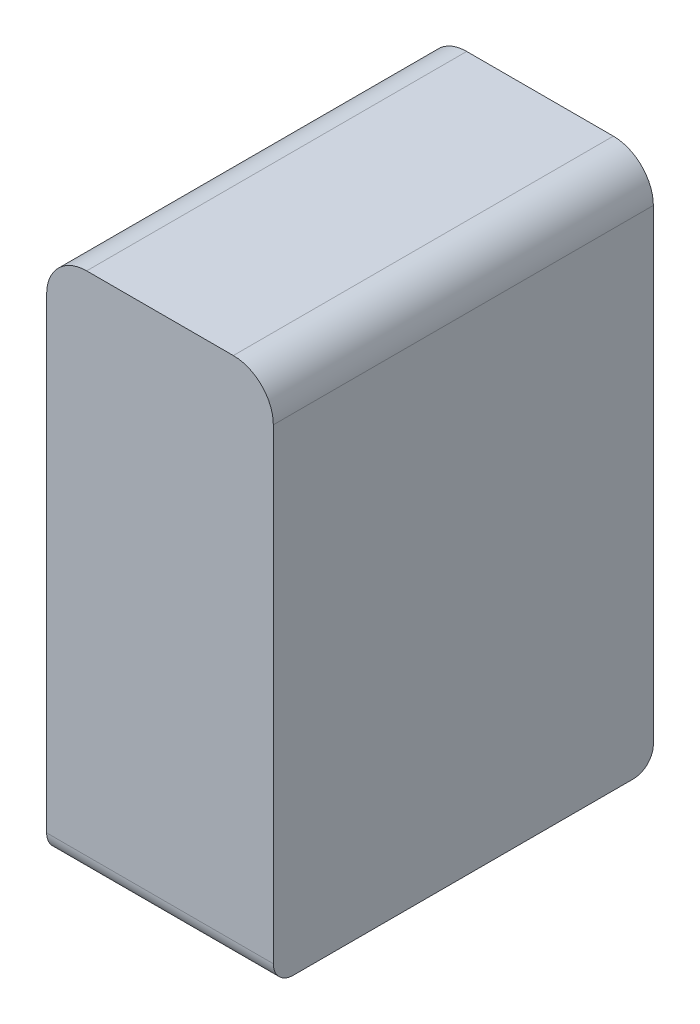
ISO-10303-21;
HEADER;
FILE_DESCRIPTION(('STEP AP214'),'2;1');
FILE_NAME('part.step','',(''),(''),'','','');
FILE_SCHEMA(('AUTOMOTIVE_DESIGN { 1 0 10303 214 1 1 1 1 }'));
ENDSEC;
DATA;
#1=APPLICATION_CONTEXT('core data for automotive mechanical design processes');
#2=APPLICATION_PROTOCOL_DEFINITION('international standard','automotive_design',2000,#1);
#3=PRODUCT_CONTEXT('',#1,'mechanical');
#4=PRODUCT('Part','Part','',(#3));
#5=PRODUCT_RELATED_PRODUCT_CATEGORY('part','',(#4));
#6=PRODUCT_DEFINITION_FORMATION('','',#4);
#7=PRODUCT_DEFINITION_CONTEXT('part definition',#1,'design');
#8=PRODUCT_DEFINITION('design','',#6,#7);
#9=PRODUCT_DEFINITION_SHAPE('','',#8);
#10=(LENGTH_UNIT() NAMED_UNIT(*) SI_UNIT(.MILLI.,.METRE.));
#11=(NAMED_UNIT(*) PLANE_ANGLE_UNIT() SI_UNIT($,.RADIAN.));
#12=(NAMED_UNIT(*) SI_UNIT($,.STERADIAN.) SOLID_ANGLE_UNIT());
#13=UNCERTAINTY_MEASURE_WITH_UNIT(LENGTH_MEASURE(1.E-05),#10,'distance_accuracy_value','');
#14=(GEOMETRIC_REPRESENTATION_CONTEXT(3) GLOBAL_UNCERTAINTY_ASSIGNED_CONTEXT((#13)) GLOBAL_UNIT_ASSIGNED_CONTEXT((#10,
#11,#12)) REPRESENTATION_CONTEXT('',''));
#15=CARTESIAN_POINT('',(0.,0.,0.));
#16=DIRECTION('',(0.,0.,1.));
#17=DIRECTION('',(1.,0.,0.));
#18=AXIS2_PLACEMENT_3D('',#15,#16,#17);
#19=CARTESIAN_POINT('',(17.,-39.5,57.));
#20=DIRECTION('',(-1.,0.,0.));
#21=DIRECTION('',(0.,0.,1.));
#22=AXIS2_PLACEMENT_3D('',#19,#20,#21);
#23=PLANE('',#22);
#24=DIRECTION('',(0.,1.,0.));
#25=VECTOR('',#24,1.);
#26=CARTESIAN_POINT('',(17.,-39.5,57.));
#27=LINE('',#26,#25);
#28=CARTESIAN_POINT('',(17.,-36.5,57.));
#29=VERTEX_POINT('',#28);
#30=CARTESIAN_POINT('',(17.,33.5,57.));
#31=VERTEX_POINT('',#30);
#32=EDGE_CURVE('E129',#29,#31,#27,.T.);
#33=ORIENTED_EDGE('',*,*,#32,.F.);
#34=CARTESIAN_POINT('',(17.,-36.5,54.));
#35=DIRECTION('',(-1.,0.,0.));
#36=DIRECTION('',(0.,0.,1.));
#37=AXIS2_PLACEMENT_3D('',#34,#35,#36);
#38=CIRCLE('',#37,3.);
#39=CARTESIAN_POINT('',(17.,-39.5,54.));
#40=VERTEX_POINT('',#39);
#41=EDGE_CURVE('E155',#29,#40,#38,.F.);
#42=ORIENTED_EDGE('',*,*,#41,.T.);
#43=DIRECTION('',(0.,0.,-1.));
#44=VECTOR('',#43,1.);
#45=CARTESIAN_POINT('',(17.,-39.5,57.));
#46=LINE('',#45,#44);
#47=CARTESIAN_POINT('',(17.,-39.5,3.00000000000002));
#48=VERTEX_POINT('',#47);
#49=EDGE_CURVE('E134',#40,#48,#46,.T.);
#50=ORIENTED_EDGE('',*,*,#49,.T.);
#51=CARTESIAN_POINT('',(17.,-36.5,3.));
#52=DIRECTION('',(-1.,0.,0.));
#53=DIRECTION('',(0.,0.,1.));
#54=AXIS2_PLACEMENT_3D('',#51,#52,#53);
#55=CIRCLE('',#54,3.);
#56=CARTESIAN_POINT('',(17.,-36.5,0.));
#57=VERTEX_POINT('',#56);
#58=EDGE_CURVE('E153',#48,#57,#55,.F.);
#59=ORIENTED_EDGE('',*,*,#58,.T.);
#60=DIRECTION('',(0.,1.,0.));
#61=VECTOR('',#60,1.);
#62=CARTESIAN_POINT('',(17.,-39.5,0.));
#63=LINE('',#62,#61);
#64=CARTESIAN_POINT('',(17.,33.5,0.));
#65=VERTEX_POINT('',#64);
#66=EDGE_CURVE('E127',#57,#65,#63,.T.);
#67=ORIENTED_EDGE('',*,*,#66,.T.);
#68=DIRECTION('',(0.,0.,-1.));
#69=VECTOR('',#68,1.);
#70=CARTESIAN_POINT('',(17.,33.5,57.));
#71=LINE('',#70,#69);
#72=EDGE_CURVE('E111',#65,#31,#71,.F.);
#73=ORIENTED_EDGE('',*,*,#72,.T.);
#74=EDGE_LOOP('',(#33,#42,#50,#59,#67,#73));
#75=FACE_BOUND('',#74,.T.);
#76=ADVANCED_FACE('F38',(#75),#23,.F.);
#77=CARTESIAN_POINT('',(-17.,39.5,57.));
#78=DIRECTION('',(0.,-1.,0.));
#79=DIRECTION('',(0.,0.,-1.));
#80=AXIS2_PLACEMENT_3D('',#77,#78,#79);
#81=PLANE('',#80);
#82=DIRECTION('',(-1.,0.,0.));
#83=VECTOR('',#82,1.);
#84=CARTESIAN_POINT('',(-17.,39.5,57.));
#85=LINE('',#84,#83);
#86=CARTESIAN_POINT('',(11.,39.5,57.));
#87=VERTEX_POINT('',#86);
#88=CARTESIAN_POINT('',(-11.,39.5,57.));
#89=VERTEX_POINT('',#88);
#90=EDGE_CURVE('E122',#87,#89,#85,.T.);
#91=ORIENTED_EDGE('',*,*,#90,.F.);
#92=DIRECTION('',(0.,0.,-1.));
#93=VECTOR('',#92,1.);
#94=CARTESIAN_POINT('',(11.,39.5,57.));
#95=LINE('',#94,#93);
#96=CARTESIAN_POINT('',(11.,39.5,0.));
#97=VERTEX_POINT('',#96);
#98=EDGE_CURVE('E109',#87,#97,#95,.T.);
#99=ORIENTED_EDGE('',*,*,#98,.T.);
#100=DIRECTION('',(-1.,0.,0.));
#101=VECTOR('',#100,1.);
#102=CARTESIAN_POINT('',(-17.,39.5,0.));
#103=LINE('',#102,#101);
#104=CARTESIAN_POINT('',(-11.,39.5,0.));
#105=VERTEX_POINT('',#104);
#106=EDGE_CURVE('E119',#97,#105,#103,.T.);
#107=ORIENTED_EDGE('',*,*,#106,.T.);
#108=DIRECTION('',(0.,0.,-1.));
#109=VECTOR('',#108,1.);
#110=CARTESIAN_POINT('',(-11.,39.5,57.));
#111=LINE('',#110,#109);
#112=EDGE_CURVE('E123',#105,#89,#111,.F.);
#113=ORIENTED_EDGE('',*,*,#112,.T.);
#114=EDGE_LOOP('',(#91,#99,#107,#113));
#115=FACE_BOUND('',#114,.T.);
#116=ADVANCED_FACE('F118',(#115),#81,.F.);
#117=CARTESIAN_POINT('',(-17.,-39.5,57.));
#118=DIRECTION('',(1.,0.,0.));
#119=DIRECTION('',(0.,0.,-1.));
#120=AXIS2_PLACEMENT_3D('',#117,#118,#119);
#121=PLANE('',#120);
#122=DIRECTION('',(0.,0.,-1.));
#123=VECTOR('',#122,1.);
#124=CARTESIAN_POINT('',(-17.,-39.5,57.));
#125=LINE('',#124,#123);
#126=CARTESIAN_POINT('',(-17.,-39.5,54.));
#127=VERTEX_POINT('',#126);
#128=CARTESIAN_POINT('',(-17.,-39.5,3.00000000000002));
#129=VERTEX_POINT('',#128);
#130=EDGE_CURVE('E137',#127,#129,#125,.T.);
#131=ORIENTED_EDGE('',*,*,#130,.F.);
#132=CARTESIAN_POINT('',(-17.,-36.5,54.));
#133=DIRECTION('',(1.,0.,0.));
#134=DIRECTION('',(0.,0.,-1.));
#135=AXIS2_PLACEMENT_3D('',#132,#133,#134);
#136=CIRCLE('',#135,3.);
#137=CARTESIAN_POINT('',(-17.,-36.5,57.));
#138=VERTEX_POINT('',#137);
#139=EDGE_CURVE('E46',#127,#138,#136,.F.);
#140=ORIENTED_EDGE('',*,*,#139,.T.);
#141=DIRECTION('',(0.,-1.,0.));
#142=VECTOR('',#141,1.);
#143=CARTESIAN_POINT('',(-17.,-39.5,57.));
#144=LINE('',#143,#142);
#145=CARTESIAN_POINT('',(-17.,33.5,57.));
#146=VERTEX_POINT('',#145);
#147=EDGE_CURVE('E138',#146,#138,#144,.T.);
#148=ORIENTED_EDGE('',*,*,#147,.F.);
#149=DIRECTION('',(0.,0.,-1.));
#150=VECTOR('',#149,1.);
#151=CARTESIAN_POINT('',(-17.,33.5,57.));
#152=LINE('',#151,#150);
#153=CARTESIAN_POINT('',(-17.,33.5,0.));
#154=VERTEX_POINT('',#153);
#155=EDGE_CURVE('E147',#146,#154,#152,.T.);
#156=ORIENTED_EDGE('',*,*,#155,.T.);
#157=DIRECTION('',(0.,-1.,0.));
#158=VECTOR('',#157,1.);
#159=CARTESIAN_POINT('',(-17.,-39.5,0.));
#160=LINE('',#159,#158);
#161=CARTESIAN_POINT('',(-17.,-36.5,0.));
#162=VERTEX_POINT('',#161);
#163=EDGE_CURVE('E126',#154,#162,#160,.T.);
#164=ORIENTED_EDGE('',*,*,#163,.T.);
#165=CARTESIAN_POINT('',(-17.,-36.5,3.));
#166=DIRECTION('',(1.,0.,0.));
#167=DIRECTION('',(0.,0.,-1.));
#168=AXIS2_PLACEMENT_3D('',#165,#166,#167);
#169=CIRCLE('',#168,3.);
#170=EDGE_CURVE('E58',#162,#129,#169,.F.);
#171=ORIENTED_EDGE('',*,*,#170,.T.);
#172=EDGE_LOOP('',(#131,#140,#148,#156,#164,#171));
#173=FACE_BOUND('',#172,.T.);
#174=ADVANCED_FACE('F165',(#173),#121,.F.);
#175=CARTESIAN_POINT('',(-17.,-39.5,57.));
#176=DIRECTION('',(0.,1.,0.));
#177=DIRECTION('',(0.,0.,1.));
#178=AXIS2_PLACEMENT_3D('',#175,#176,#177);
#179=PLANE('',#178);
#180=ORIENTED_EDGE('',*,*,#49,.F.);
#181=DIRECTION('',(1.,0.,0.));
#182=VECTOR('',#181,1.);
#183=CARTESIAN_POINT('',(-17.,-39.5,54.));
#184=LINE('',#183,#182);
#185=EDGE_CURVE('E160',#40,#127,#184,.F.);
#186=ORIENTED_EDGE('',*,*,#185,.T.);
#187=ORIENTED_EDGE('',*,*,#130,.T.);
#188=DIRECTION('',(1.,0.,0.));
#189=VECTOR('',#188,1.);
#190=CARTESIAN_POINT('',(17.,-39.5,3.));
#191=LINE('',#190,#189);
#192=EDGE_CURVE('E157',#129,#48,#191,.T.);
#193=ORIENTED_EDGE('',*,*,#192,.T.);
#194=EDGE_LOOP('',(#180,#186,#187,#193));
#195=FACE_BOUND('',#194,.T.);
#196=ADVANCED_FACE('F178',(#195),#179,.F.);
#197=CARTESIAN_POINT('',(0.,0.,57.));
#198=DIRECTION('',(0.,0.,-1.));
#199=DIRECTION('',(-1.,0.,0.));
#200=AXIS2_PLACEMENT_3D('',#197,#198,#199);
#201=PLANE('',#200);
#202=ORIENTED_EDGE('',*,*,#147,.T.);
#203=DIRECTION('',(1.,0.,0.));
#204=VECTOR('',#203,1.);
#205=CARTESIAN_POINT('',(0.,-36.5,57.));
#206=LINE('',#205,#204);
#207=EDGE_CURVE('E150',#138,#29,#206,.T.);
#208=ORIENTED_EDGE('',*,*,#207,.T.);
#209=ORIENTED_EDGE('',*,*,#32,.T.);
#210=CARTESIAN_POINT('',(11.,33.5,57.));
#211=DIRECTION('',(0.,0.,-1.));
#212=DIRECTION('',(-1.,0.,0.));
#213=AXIS2_PLACEMENT_3D('',#210,#211,#212);
#214=CIRCLE('',#213,6.);
#215=EDGE_CURVE('E145',#31,#87,#214,.F.);
#216=ORIENTED_EDGE('',*,*,#215,.T.);
#217=ORIENTED_EDGE('',*,*,#90,.T.);
#218=CARTESIAN_POINT('',(-11.,33.5,57.));
#219=DIRECTION('',(0.,0.,-1.));
#220=DIRECTION('',(-1.,0.,0.));
#221=AXIS2_PLACEMENT_3D('',#218,#219,#220);
#222=CIRCLE('',#221,6.);
#223=EDGE_CURVE('E143',#89,#146,#222,.F.);
#224=ORIENTED_EDGE('',*,*,#223,.T.);
#225=EDGE_LOOP('',(#202,#208,#209,#216,#217,#224));
#226=FACE_BOUND('',#225,.T.);
#227=ADVANCED_FACE('F171',(#226),#201,.F.);
#228=CARTESIAN_POINT('',(0.,0.,0.));
#229=DIRECTION('',(0.,0.,-1.));
#230=DIRECTION('',(-1.,0.,0.));
#231=AXIS2_PLACEMENT_3D('',#228,#229,#230);
#232=PLANE('',#231);
#233=ORIENTED_EDGE('',*,*,#66,.F.);
#234=DIRECTION('',(1.,0.,0.));
#235=VECTOR('',#234,1.);
#236=CARTESIAN_POINT('',(-17.,-36.5,0.));
#237=LINE('',#236,#235);
#238=EDGE_CURVE('E11',#57,#162,#237,.F.);
#239=ORIENTED_EDGE('',*,*,#238,.T.);
#240=ORIENTED_EDGE('',*,*,#163,.F.);
#241=CARTESIAN_POINT('',(-11.,33.5,0.));
#242=DIRECTION('',(0.,0.,-1.));
#243=DIRECTION('',(-1.,0.,0.));
#244=AXIS2_PLACEMENT_3D('',#241,#242,#243);
#245=CIRCLE('',#244,6.);
#246=EDGE_CURVE('E113',#154,#105,#245,.T.);
#247=ORIENTED_EDGE('',*,*,#246,.T.);
#248=ORIENTED_EDGE('',*,*,#106,.F.);
#249=CARTESIAN_POINT('',(11.,33.5,0.));
#250=DIRECTION('',(0.,0.,-1.));
#251=DIRECTION('',(-1.,0.,0.));
#252=AXIS2_PLACEMENT_3D('',#249,#250,#251);
#253=CIRCLE('',#252,6.);
#254=EDGE_CURVE('E105',#97,#65,#253,.T.);
#255=ORIENTED_EDGE('',*,*,#254,.T.);
#256=EDGE_LOOP('',(#233,#239,#240,#247,#248,#255));
#257=FACE_BOUND('',#256,.T.);
#258=ADVANCED_FACE('F125',(#257),#232,.T.);
#259=CARTESIAN_POINT('',(11.,33.5,57.));
#260=DIRECTION('',(0.,0.,-1.));
#261=DIRECTION('',(-1.,0.,0.));
#262=AXIS2_PLACEMENT_3D('',#259,#260,#261);
#263=CYLINDRICAL_SURFACE('',#262,6.);
#264=ORIENTED_EDGE('',*,*,#215,.F.);
#265=ORIENTED_EDGE('',*,*,#72,.F.);
#266=ORIENTED_EDGE('',*,*,#254,.F.);
#267=ORIENTED_EDGE('',*,*,#98,.F.);
#268=EDGE_LOOP('',(#264,#265,#266,#267));
#269=FACE_BOUND('',#268,.T.);
#270=ADVANCED_FACE('F108',(#269),#263,.T.);
#271=CARTESIAN_POINT('',(-11.,33.5,57.));
#272=DIRECTION('',(0.,0.,-1.));
#273=DIRECTION('',(-1.,0.,0.));
#274=AXIS2_PLACEMENT_3D('',#271,#272,#273);
#275=CYLINDRICAL_SURFACE('',#274,6.);
#276=ORIENTED_EDGE('',*,*,#223,.F.);
#277=ORIENTED_EDGE('',*,*,#112,.F.);
#278=ORIENTED_EDGE('',*,*,#246,.F.);
#279=ORIENTED_EDGE('',*,*,#155,.F.);
#280=EDGE_LOOP('',(#276,#277,#278,#279));
#281=FACE_BOUND('',#280,.T.);
#282=ADVANCED_FACE('F184',(#281),#275,.T.);
#283=CARTESIAN_POINT('',(0.,-36.5,54.));
#284=DIRECTION('',(1.,0.,0.));
#285=DIRECTION('',(0.,0.,-1.));
#286=AXIS2_PLACEMENT_3D('',#283,#284,#285);
#287=CYLINDRICAL_SURFACE('',#286,3.);
#288=ORIENTED_EDGE('',*,*,#139,.F.);
#289=ORIENTED_EDGE('',*,*,#185,.F.);
#290=ORIENTED_EDGE('',*,*,#41,.F.);
#291=ORIENTED_EDGE('',*,*,#207,.F.);
#292=EDGE_LOOP('',(#288,#289,#290,#291));
#293=FACE_BOUND('',#292,.T.);
#294=ADVANCED_FACE('F174',(#293),#287,.T.);
#295=CARTESIAN_POINT('',(-17.,-36.5,3.));
#296=DIRECTION('',(-1.,0.,0.));
#297=DIRECTION('',(0.,0.,1.));
#298=AXIS2_PLACEMENT_3D('',#295,#296,#297);
#299=CYLINDRICAL_SURFACE('',#298,3.);
#300=ORIENTED_EDGE('',*,*,#170,.F.);
#301=ORIENTED_EDGE('',*,*,#238,.F.);
#302=ORIENTED_EDGE('',*,*,#58,.F.);
#303=ORIENTED_EDGE('',*,*,#192,.F.);
#304=EDGE_LOOP('',(#300,#301,#302,#303));
#305=FACE_BOUND('',#304,.T.);
#306=ADVANCED_FACE('F40',(#305),#299,.T.);
#307=CLOSED_SHELL('',(#76,#116,#174,#196,#227,#258,#270,#282,#294,#306));
#308=MANIFOLD_SOLID_BREP('B2',#307);
#309=ADVANCED_BREP_SHAPE_REPRESENTATION('',(#18,#308),#14);
#310=SHAPE_DEFINITION_REPRESENTATION(#9,#309);
ENDSEC;
END-ISO-10303-21;
